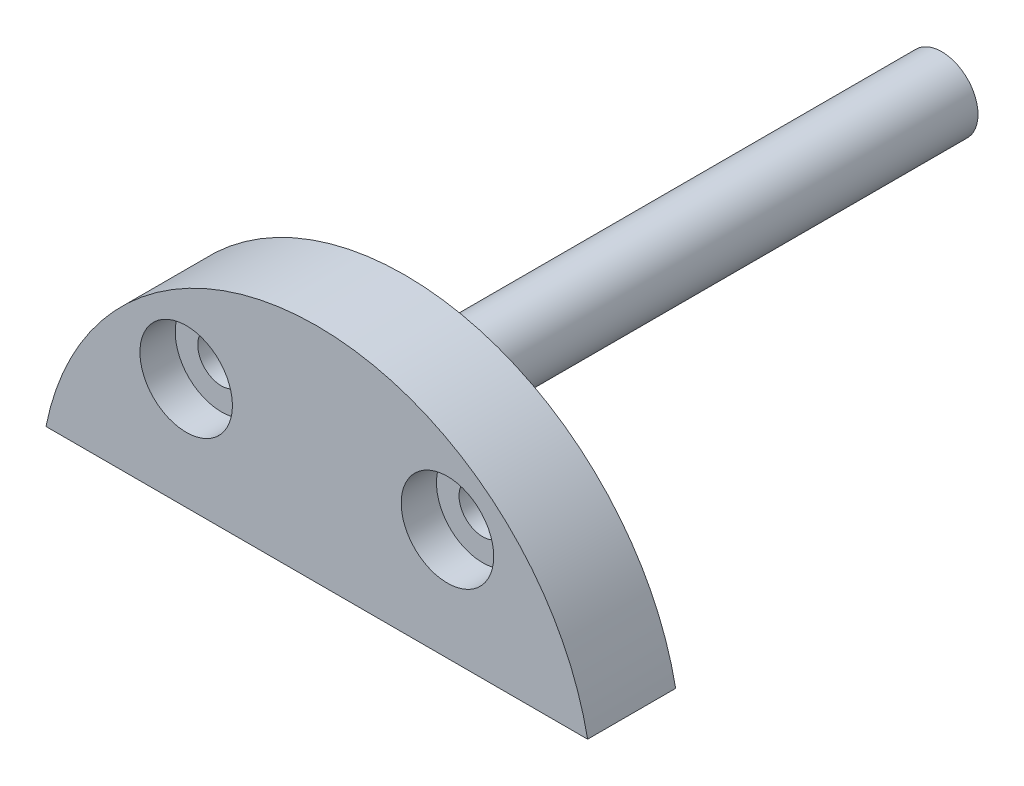
ISO-10303-21;
HEADER;
FILE_DESCRIPTION(('STEP AP214'),'2;1');
FILE_NAME('part.step','',(''),(''),'','','');
FILE_SCHEMA(('AUTOMOTIVE_DESIGN { 1 0 10303 214 1 1 1 1 }'));
ENDSEC;
DATA;
#1=APPLICATION_CONTEXT('core data for automotive mechanical design processes');
#2=APPLICATION_PROTOCOL_DEFINITION('international standard','automotive_design',2000,#1);
#3=PRODUCT_CONTEXT('',#1,'mechanical');
#4=PRODUCT('Part','Part','',(#3));
#5=PRODUCT_RELATED_PRODUCT_CATEGORY('part','',(#4));
#6=PRODUCT_DEFINITION_FORMATION('','',#4);
#7=PRODUCT_DEFINITION_CONTEXT('part definition',#1,'design');
#8=PRODUCT_DEFINITION('design','',#6,#7);
#9=PRODUCT_DEFINITION_SHAPE('','',#8);
#10=(LENGTH_UNIT() NAMED_UNIT(*) SI_UNIT(.MILLI.,.METRE.));
#11=(NAMED_UNIT(*) PLANE_ANGLE_UNIT() SI_UNIT($,.RADIAN.));
#12=(NAMED_UNIT(*) SI_UNIT($,.STERADIAN.) SOLID_ANGLE_UNIT());
#13=UNCERTAINTY_MEASURE_WITH_UNIT(LENGTH_MEASURE(1.E-05),#10,'distance_accuracy_value','');
#14=(GEOMETRIC_REPRESENTATION_CONTEXT(3) GLOBAL_UNCERTAINTY_ASSIGNED_CONTEXT((#13)) GLOBAL_UNIT_ASSIGNED_CONTEXT((#10,
#11,#12)) REPRESENTATION_CONTEXT('',''));
#15=CARTESIAN_POINT('',(0.,0.,0.));
#16=DIRECTION('',(0.,0.,1.));
#17=DIRECTION('',(1.,0.,0.));
#18=AXIS2_PLACEMENT_3D('',#15,#16,#17);
#19=CARTESIAN_POINT('',(14.3340852567701,12.215,-68.571));
#20=DIRECTION('',(0.,0.,1.));
#21=DIRECTION('',(1.,0.,0.));
#22=AXIS2_PLACEMENT_3D('',#19,#20,#21);
#23=CYLINDRICAL_SURFACE('',#22,2.6);
#24=CARTESIAN_POINT('',(14.3340852567701,12.215,-9.66));
#25=DIRECTION('',(0.,0.,-1.));
#26=DIRECTION('',(-1.,0.,0.));
#27=AXIS2_PLACEMENT_3D('',#24,#25,#26);
#28=CIRCLE('',#27,2.6);
#29=CARTESIAN_POINT('',(11.7340852567701,12.215,-9.66));
#30=VERTEX_POINT('',#29);
#31=EDGE_CURVE('E101',#30,#30,#28,.F.);
#32=ORIENTED_EDGE('',*,*,#31,.F.);
#33=EDGE_LOOP('',(#32));
#34=FACE_BOUND('',#33,.T.);
#35=CARTESIAN_POINT('',(14.3340852567701,12.215,-3.87));
#36=DIRECTION('',(0.,0.,1.));
#37=DIRECTION('',(1.,0.,0.));
#38=AXIS2_PLACEMENT_3D('',#35,#36,#37);
#39=CIRCLE('',#38,2.6);
#40=CARTESIAN_POINT('',(16.9340852567701,12.215,-3.87));
#41=VERTEX_POINT('',#40);
#42=EDGE_CURVE('E45',#41,#41,#39,.F.);
#43=ORIENTED_EDGE('',*,*,#42,.F.);
#44=EDGE_LOOP('',(#43));
#45=FACE_BOUND('',#44,.T.);
#46=ADVANCED_FACE('F41',(#34,#45),#23,.F.);
#47=CARTESIAN_POINT('',(-14.3340852567701,12.215,-68.571));
#48=DIRECTION('',(0.,0.,1.));
#49=DIRECTION('',(1.,0.,0.));
#50=AXIS2_PLACEMENT_3D('',#47,#48,#49);
#51=CYLINDRICAL_SURFACE('',#50,2.6);
#52=CARTESIAN_POINT('',(-14.3340852567701,12.215,-9.66));
#53=DIRECTION('',(0.,0.,-1.));
#54=DIRECTION('',(-1.,0.,0.));
#55=AXIS2_PLACEMENT_3D('',#52,#53,#54);
#56=CIRCLE('',#55,2.6);
#57=CARTESIAN_POINT('',(-16.9340852567701,12.215,-9.66));
#58=VERTEX_POINT('',#57);
#59=EDGE_CURVE('E119',#58,#58,#56,.F.);
#60=ORIENTED_EDGE('',*,*,#59,.F.);
#61=EDGE_LOOP('',(#60));
#62=FACE_BOUND('',#61,.T.);
#63=CARTESIAN_POINT('',(-14.3340852567701,12.215,-3.87));
#64=DIRECTION('',(0.,0.,1.));
#65=DIRECTION('',(1.,0.,0.));
#66=AXIS2_PLACEMENT_3D('',#63,#64,#65);
#67=CIRCLE('',#66,2.6);
#68=CARTESIAN_POINT('',(-11.7340852567701,12.215,-3.87));
#69=VERTEX_POINT('',#68);
#70=EDGE_CURVE('E92',#69,#69,#67,.F.);
#71=ORIENTED_EDGE('',*,*,#70,.F.);
#72=EDGE_LOOP('',(#71));
#73=FACE_BOUND('',#72,.T.);
#74=ADVANCED_FACE('F154',(#62,#73),#51,.F.);
#75=CARTESIAN_POINT('',(0.,-5.85665830945559,-9.66));
#76=DIRECTION('',(0.,0.,1.));
#77=DIRECTION('',(1.,0.,0.));
#78=AXIS2_PLACEMENT_3D('',#75,#76,#77);
#79=CYLINDRICAL_SURFACE('',#78,30.2866583094556);
#80=CARTESIAN_POINT('',(0.,-5.85665830945559,0.));
#81=DIRECTION('',(0.,0.,1.));
#82=DIRECTION('',(-1.,0.,0.));
#83=AXIS2_PLACEMENT_3D('',#80,#81,#82);
#84=CIRCLE('',#83,30.2866583094556);
#85=CARTESIAN_POINT('',(29.715,0.,0.));
#86=VERTEX_POINT('',#85);
#87=CARTESIAN_POINT('',(-29.715,0.,0.));
#88=VERTEX_POINT('',#87);
#89=EDGE_CURVE('E78',#86,#88,#84,.T.);
#90=ORIENTED_EDGE('',*,*,#89,.F.);
#91=DIRECTION('',(0.,0.,1.));
#92=VECTOR('',#91,1.);
#93=CARTESIAN_POINT('',(29.715,0.,-9.66));
#94=LINE('',#93,#92);
#95=CARTESIAN_POINT('',(29.715,0.,-9.66));
#96=VERTEX_POINT('',#95);
#97=EDGE_CURVE('E52',#96,#86,#94,.T.);
#98=ORIENTED_EDGE('',*,*,#97,.F.);
#99=CARTESIAN_POINT('',(0.,-5.85665830945559,-9.66));
#100=DIRECTION('',(0.,0.,1.));
#101=DIRECTION('',(-1.,0.,0.));
#102=AXIS2_PLACEMENT_3D('',#99,#100,#101);
#103=CIRCLE('',#102,30.2866583094556);
#104=CARTESIAN_POINT('',(-29.715,0.,-9.66));
#105=VERTEX_POINT('',#104);
#106=EDGE_CURVE('E85',#96,#105,#103,.T.);
#107=ORIENTED_EDGE('',*,*,#106,.T.);
#108=DIRECTION('',(0.,0.,1.));
#109=VECTOR('',#108,1.);
#110=CARTESIAN_POINT('',(-29.715,0.,-9.66));
#111=LINE('',#110,#109);
#112=EDGE_CURVE('E66',#105,#88,#111,.T.);
#113=ORIENTED_EDGE('',*,*,#112,.T.);
#114=EDGE_LOOP('',(#90,#98,#107,#113));
#115=FACE_BOUND('',#114,.T.);
#116=ADVANCED_FACE('F43',(#115),#79,.T.);
#117=CARTESIAN_POINT('',(-29.715,0.,-9.66));
#118=DIRECTION('',(0.,-1.,0.));
#119=DIRECTION('',(0.,0.,-1.));
#120=AXIS2_PLACEMENT_3D('',#117,#118,#119);
#121=PLANE('',#120);
#122=DIRECTION('',(1.,0.,0.));
#123=VECTOR('',#122,1.);
#124=CARTESIAN_POINT('',(-29.715,0.,0.));
#125=LINE('',#124,#123);
#126=EDGE_CURVE('E73',#88,#86,#125,.T.);
#127=ORIENTED_EDGE('',*,*,#126,.F.);
#128=ORIENTED_EDGE('',*,*,#112,.F.);
#129=DIRECTION('',(1.,0.,0.));
#130=VECTOR('',#129,1.);
#131=CARTESIAN_POINT('',(-29.715,0.,-9.66));
#132=LINE('',#131,#130);
#133=EDGE_CURVE('E75',#105,#96,#132,.T.);
#134=ORIENTED_EDGE('',*,*,#133,.T.);
#135=ORIENTED_EDGE('',*,*,#97,.T.);
#136=EDGE_LOOP('',(#127,#128,#134,#135));
#137=FACE_BOUND('',#136,.T.);
#138=ADVANCED_FACE('F71',(#137),#121,.T.);
#139=CARTESIAN_POINT('',(0.,-5.85665830945559,-9.66));
#140=DIRECTION('',(0.,0.,-1.));
#141=DIRECTION('',(-1.,0.,0.));
#142=AXIS2_PLACEMENT_3D('',#139,#140,#141);
#143=PLANE('',#142);
#144=ORIENTED_EDGE('',*,*,#59,.T.);
#145=EDGE_LOOP('',(#144));
#146=FACE_BOUND('',#145,.T.);
#147=ORIENTED_EDGE('',*,*,#31,.T.);
#148=EDGE_LOOP('',(#147));
#149=FACE_BOUND('',#148,.T.);
#150=CARTESIAN_POINT('',(0.,12.215,-9.66));
#151=DIRECTION('',(0.,0.,-1.));
#152=DIRECTION('',(-1.,0.,0.));
#153=AXIS2_PLACEMENT_3D('',#150,#151,#152);
#154=CIRCLE('',#153,3.98);
#155=CARTESIAN_POINT('',(3.98,12.215,-9.65999999999999));
#156=VERTEX_POINT('',#155);
#157=EDGE_CURVE('E11',#156,#156,#154,.T.);
#158=ORIENTED_EDGE('',*,*,#157,.F.);
#159=EDGE_LOOP('',(#158));
#160=FACE_BOUND('',#159,.T.);
#161=ORIENTED_EDGE('',*,*,#106,.F.);
#162=ORIENTED_EDGE('',*,*,#133,.F.);
#163=EDGE_LOOP('',(#161,#162));
#164=FACE_BOUND('',#163,.T.);
#165=ADVANCED_FACE('F139',(#146,#149,#160,#164),#143,.T.);
#166=CARTESIAN_POINT('',(0.,-5.85665830945559,0.));
#167=DIRECTION('',(0.,0.,-1.));
#168=DIRECTION('',(-1.,0.,0.));
#169=AXIS2_PLACEMENT_3D('',#166,#167,#168);
#170=PLANE('',#169);
#171=CARTESIAN_POINT('',(14.3340852567701,12.215,0.));
#172=DIRECTION('',(0.,0.,1.));
#173=DIRECTION('',(1.,0.,0.));
#174=AXIS2_PLACEMENT_3D('',#171,#172,#173);
#175=CIRCLE('',#174,5.075);
#176=CARTESIAN_POINT('',(19.4090852567701,12.215,0.));
#177=VERTEX_POINT('',#176);
#178=EDGE_CURVE('E103',#177,#177,#175,.T.);
#179=ORIENTED_EDGE('',*,*,#178,.F.);
#180=EDGE_LOOP('',(#179));
#181=FACE_BOUND('',#180,.T.);
#182=CARTESIAN_POINT('',(-14.3340852567701,12.215,0.));
#183=DIRECTION('',(0.,0.,1.));
#184=DIRECTION('',(1.,0.,0.));
#185=AXIS2_PLACEMENT_3D('',#182,#183,#184);
#186=CIRCLE('',#185,5.075);
#187=CARTESIAN_POINT('',(-9.25908525677012,12.215,0.));
#188=VERTEX_POINT('',#187);
#189=EDGE_CURVE('E115',#188,#188,#186,.T.);
#190=ORIENTED_EDGE('',*,*,#189,.F.);
#191=EDGE_LOOP('',(#190));
#192=FACE_BOUND('',#191,.T.);
#193=ORIENTED_EDGE('',*,*,#89,.T.);
#194=ORIENTED_EDGE('',*,*,#126,.T.);
#195=EDGE_LOOP('',(#193,#194));
#196=FACE_BOUND('',#195,.T.);
#197=ADVANCED_FACE('F83',(#181,#192,#196),#170,.F.);
#198=CARTESIAN_POINT('',(0.,12.215,-68.57));
#199=DIRECTION('',(0.,0.,1.));
#200=DIRECTION('',(1.,0.,0.));
#201=AXIS2_PLACEMENT_3D('',#198,#199,#200);
#202=CYLINDRICAL_SURFACE('',#201,3.98);
#203=CARTESIAN_POINT('',(0.,12.215,-68.57));
#204=DIRECTION('',(0.,0.,-1.));
#205=DIRECTION('',(-1.,0.,0.));
#206=AXIS2_PLACEMENT_3D('',#203,#204,#205);
#207=CIRCLE('',#206,3.98);
#208=CARTESIAN_POINT('',(3.98,12.215,-68.57));
#209=VERTEX_POINT('',#208);
#210=EDGE_CURVE('E81',#209,#209,#207,.T.);
#211=CARTESIAN_POINT('',(3.98,12.215,-68.57));
#212=CARTESIAN_POINT('',(3.98,12.215,-67.9563541666666));
#213=CARTESIAN_POINT('',(3.98,12.215,-67.3427083333333));
#214=CARTESIAN_POINT('',(3.98,12.215,-66.1154166666667));
#215=CARTESIAN_POINT('',(3.98,12.215,-65.5017708333333));
#216=CARTESIAN_POINT('',(3.98,12.215,-64.2744791666667));
#217=CARTESIAN_POINT('',(3.98,12.215,-63.6608333333333));
#218=CARTESIAN_POINT('',(3.98,12.215,-62.4335416666667));
#219=CARTESIAN_POINT('',(3.98,12.215,-61.8198958333333));
#220=CARTESIAN_POINT('',(3.98,12.215,-60.5926041666667));
#221=CARTESIAN_POINT('',(3.98,12.215,-59.9789583333333));
#222=CARTESIAN_POINT('',(3.98,12.215,-58.7516666666667));
#223=CARTESIAN_POINT('',(3.98,12.215,-58.1380208333333));
#224=CARTESIAN_POINT('',(3.98,12.215,-56.9107291666667));
#225=CARTESIAN_POINT('',(3.98,12.215,-56.2970833333333));
#226=CARTESIAN_POINT('',(3.98,12.215,-55.0697916666667));
#227=CARTESIAN_POINT('',(3.98,12.215,-54.4561458333333));
#228=CARTESIAN_POINT('',(3.98,12.215,-53.2288541666667));
#229=CARTESIAN_POINT('',(3.98,12.215,-52.6152083333333));
#230=CARTESIAN_POINT('',(3.98,12.215,-51.3879166666666));
#231=CARTESIAN_POINT('',(3.98,12.215,-50.7742708333333));
#232=CARTESIAN_POINT('',(3.98,12.215,-49.5469791666667));
#233=CARTESIAN_POINT('',(3.98,12.215,-48.9333333333333));
#234=CARTESIAN_POINT('',(3.98,12.215,-47.7060416666666));
#235=CARTESIAN_POINT('',(3.98,12.215,-47.0923958333333));
#236=CARTESIAN_POINT('',(3.98,12.215,-45.8651041666666));
#237=CARTESIAN_POINT('',(3.98,12.215,-45.2514583333333));
#238=CARTESIAN_POINT('',(3.98,12.215,-44.0241666666667));
#239=CARTESIAN_POINT('',(3.98,12.215,-43.4105208333333));
#240=CARTESIAN_POINT('',(3.98,12.215,-42.1832291666667));
#241=CARTESIAN_POINT('',(3.98,12.215,-41.5695833333333));
#242=CARTESIAN_POINT('',(3.98,12.215,-40.3422916666667));
#243=CARTESIAN_POINT('',(3.98,12.215,-39.7286458333333));
#244=CARTESIAN_POINT('',(3.98,12.215,-38.5013541666667));
#245=CARTESIAN_POINT('',(3.98,12.215,-37.8877083333333));
#246=CARTESIAN_POINT('',(3.98,12.215,-36.6604166666667));
#247=CARTESIAN_POINT('',(3.98,12.215,-36.0467708333333));
#248=CARTESIAN_POINT('',(3.98,12.215,-34.8194791666667));
#249=CARTESIAN_POINT('',(3.98,12.215,-34.2058333333333));
#250=CARTESIAN_POINT('',(3.98,12.215,-32.9785416666667));
#251=CARTESIAN_POINT('',(3.98,12.215,-32.3648958333333));
#252=CARTESIAN_POINT('',(3.98,12.215,-31.1376041666667));
#253=CARTESIAN_POINT('',(3.98,12.215,-30.5239583333333));
#254=CARTESIAN_POINT('',(3.98,12.215,-29.2966666666667));
#255=CARTESIAN_POINT('',(3.98,12.215,-28.6830208333333));
#256=CARTESIAN_POINT('',(3.98,12.215,-27.4557291666667));
#257=CARTESIAN_POINT('',(3.98,12.215,-26.8420833333333));
#258=CARTESIAN_POINT('',(3.98,12.215,-25.6147916666667));
#259=CARTESIAN_POINT('',(3.98,12.215,-25.0011458333333));
#260=CARTESIAN_POINT('',(3.98,12.215,-23.7738541666667));
#261=CARTESIAN_POINT('',(3.98,12.215,-23.1602083333333));
#262=CARTESIAN_POINT('',(3.98,12.215,-21.9329166666667));
#263=CARTESIAN_POINT('',(3.98,12.215,-21.3192708333333));
#264=CARTESIAN_POINT('',(3.98,12.215,-20.0919791666667));
#265=CARTESIAN_POINT('',(3.98,12.215,-19.4783333333333));
#266=CARTESIAN_POINT('',(3.98,12.215,-18.2510416666667));
#267=CARTESIAN_POINT('',(3.98,12.215,-17.6373958333333));
#268=CARTESIAN_POINT('',(3.98,12.215,-16.4101041666667));
#269=CARTESIAN_POINT('',(3.98,12.215,-15.7964583333333));
#270=CARTESIAN_POINT('',(3.98,12.215,-14.5691666666667));
#271=CARTESIAN_POINT('',(3.98,12.215,-13.9555208333333));
#272=CARTESIAN_POINT('',(3.98,12.215,-12.7282291666667));
#273=CARTESIAN_POINT('',(3.98,12.215,-12.1145833333333));
#274=CARTESIAN_POINT('',(3.98,12.215,-10.8872916666667));
#275=CARTESIAN_POINT('',(3.98,12.215,-10.2736458333333));
#276=CARTESIAN_POINT('',(3.98,12.215,-9.65999999999999));
#277=B_SPLINE_CURVE_WITH_KNOTS('',3,(#211,#212,#213,#214,#215,#216,#217,#218,#219,#220,#221,
#222,#223,#224,#225,#226,#227,#228,#229,#230,#231,#232,#233,#234,#235,#236,#237,#238,#239,#240,
#241,#242,#243,#244,#245,#246,#247,#248,#249,#250,#251,#252,#253,#254,#255,#256,#257,#258,#259,
#260,#261,#262,#263,#264,#265,#266,#267,#268,#269,#270,#271,#272,#273,#274,#275,#276),
.UNSPECIFIED.,.F.,.F.,(4,2,2,2,2,2,2,2,2,2,2,2,2,2,2,2,2,2,2,2,2,2,2,2,2,2,2,2,2,2,2,2,4),(0.,
1.84093749999999,3.68187499999999,5.52281249999999,7.36374999999999,9.20468749999999,11.045625,
12.8865625,14.7275,16.5684375,18.409375,20.2503125,22.09125,23.9321875,25.773125,27.6140625,
29.455,31.2959375,33.136875,34.9778125,36.81875,38.6596875,40.500625,42.3415625,44.1825,
46.0234375,47.864375,49.7053125,51.54625,53.3871875,55.228125,57.0690625,58.91),.UNSPECIFIED.);
#278=EDGE_CURVE('BSEAM133',#209,#156,#277,.T.);
#279=ORIENTED_EDGE('',*,*,#210,.F.);
#280=ORIENTED_EDGE('',*,*,#157,.T.);
#281=ORIENTED_EDGE('',*,*,#278,.T.);
#282=ORIENTED_EDGE('',*,*,#278,.F.);
#283=EDGE_LOOP('',(#279,#281,#280,#282));
#284=FACE_BOUND('',#283,.T.);
#285=ADVANCED_FACE('F133',(#284),#202,.T.);
#286=CARTESIAN_POINT('',(0.,12.215,-68.57));
#287=DIRECTION('',(0.,0.,-1.));
#288=DIRECTION('',(-1.,0.,0.));
#289=AXIS2_PLACEMENT_3D('',#286,#287,#288);
#290=PLANE('',#289);
#291=ORIENTED_EDGE('',*,*,#210,.T.);
#292=EDGE_LOOP('',(#291));
#293=FACE_BOUND('',#292,.T.);
#294=ADVANCED_FACE('F131',(#293),#290,.T.);
#295=CARTESIAN_POINT('',(-14.3340852567701,12.215,-3.87));
#296=DIRECTION('',(0.,0.,1.));
#297=DIRECTION('',(1.,0.,0.));
#298=AXIS2_PLACEMENT_3D('',#295,#296,#297);
#299=PLANE('',#298);
#300=CARTESIAN_POINT('',(-14.3340852567701,12.215,-3.87));
#301=DIRECTION('',(0.,0.,1.));
#302=DIRECTION('',(1.,0.,0.));
#303=AXIS2_PLACEMENT_3D('',#300,#301,#302);
#304=CIRCLE('',#303,5.075);
#305=CARTESIAN_POINT('',(-9.25908525677012,12.215,-3.87));
#306=VERTEX_POINT('',#305);
#307=EDGE_CURVE('E109',#306,#306,#304,.T.);
#308=ORIENTED_EDGE('',*,*,#307,.T.);
#309=EDGE_LOOP('',(#308));
#310=FACE_BOUND('',#309,.T.);
#311=ORIENTED_EDGE('',*,*,#70,.T.);
#312=EDGE_LOOP('',(#311));
#313=FACE_BOUND('',#312,.T.);
#314=ADVANCED_FACE('F167',(#310,#313),#299,.T.);
#315=CARTESIAN_POINT('',(-14.3340852567701,12.215,-3.87));
#316=DIRECTION('',(0.,0.,1.));
#317=DIRECTION('',(1.,0.,0.));
#318=AXIS2_PLACEMENT_3D('',#315,#316,#317);
#319=CYLINDRICAL_SURFACE('',#318,5.075);
#320=CARTESIAN_POINT('',(-9.25908525677012,12.215,-3.87));
#321=CARTESIAN_POINT('',(-9.25908525677012,12.215,-3.8296875));
#322=CARTESIAN_POINT('',(-9.25908525677012,12.215,-3.789375));
#323=CARTESIAN_POINT('',(-9.25908525677012,12.215,-3.70875));
#324=CARTESIAN_POINT('',(-9.25908525677012,12.215,-3.6684375));
#325=CARTESIAN_POINT('',(-9.25908525677012,12.215,-3.5878125));
#326=CARTESIAN_POINT('',(-9.25908525677012,12.215,-3.5475));
#327=CARTESIAN_POINT('',(-9.25908525677012,12.215,-3.466875));
#328=CARTESIAN_POINT('',(-9.25908525677012,12.215,-3.4265625));
#329=CARTESIAN_POINT('',(-9.25908525677012,12.215,-3.3459375));
#330=CARTESIAN_POINT('',(-9.25908525677012,12.215,-3.305625));
#331=CARTESIAN_POINT('',(-9.25908525677012,12.215,-3.225));
#332=CARTESIAN_POINT('',(-9.25908525677012,12.215,-3.1846875));
#333=CARTESIAN_POINT('',(-9.25908525677012,12.215,-3.1040625));
#334=CARTESIAN_POINT('',(-9.25908525677012,12.215,-3.06375));
#335=CARTESIAN_POINT('',(-9.25908525677012,12.215,-2.983125));
#336=CARTESIAN_POINT('',(-9.25908525677012,12.215,-2.9428125));
#337=CARTESIAN_POINT('',(-9.25908525677012,12.215,-2.8621875));
#338=CARTESIAN_POINT('',(-9.25908525677012,12.215,-2.821875));
#339=CARTESIAN_POINT('',(-9.25908525677012,12.215,-2.74125));
#340=CARTESIAN_POINT('',(-9.25908525677012,12.215,-2.7009375));
#341=CARTESIAN_POINT('',(-9.25908525677012,12.215,-2.6203125));
#342=CARTESIAN_POINT('',(-9.25908525677012,12.215,-2.58));
#343=CARTESIAN_POINT('',(-9.25908525677012,12.215,-2.499375));
#344=CARTESIAN_POINT('',(-9.25908525677012,12.215,-2.4590625));
#345=CARTESIAN_POINT('',(-9.25908525677012,12.215,-2.3784375));
#346=CARTESIAN_POINT('',(-9.25908525677012,12.215,-2.338125));
#347=CARTESIAN_POINT('',(-9.25908525677012,12.215,-2.2575));
#348=CARTESIAN_POINT('',(-9.25908525677012,12.215,-2.2171875));
#349=CARTESIAN_POINT('',(-9.25908525677012,12.215,-2.1365625));
#350=CARTESIAN_POINT('',(-9.25908525677012,12.215,-2.09625));
#351=CARTESIAN_POINT('',(-9.25908525677012,12.215,-2.015625));
#352=CARTESIAN_POINT('',(-9.25908525677012,12.215,-1.9753125));
#353=CARTESIAN_POINT('',(-9.25908525677012,12.215,-1.8946875));
#354=CARTESIAN_POINT('',(-9.25908525677012,12.215,-1.854375));
#355=CARTESIAN_POINT('',(-9.25908525677012,12.215,-1.77375));
#356=CARTESIAN_POINT('',(-9.25908525677012,12.215,-1.7334375));
#357=CARTESIAN_POINT('',(-9.25908525677012,12.215,-1.6528125));
#358=CARTESIAN_POINT('',(-9.25908525677012,12.215,-1.6125));
#359=CARTESIAN_POINT('',(-9.25908525677012,12.215,-1.531875));
#360=CARTESIAN_POINT('',(-9.25908525677012,12.215,-1.4915625));
#361=CARTESIAN_POINT('',(-9.25908525677012,12.215,-1.4109375));
#362=CARTESIAN_POINT('',(-9.25908525677012,12.215,-1.370625));
#363=CARTESIAN_POINT('',(-9.25908525677012,12.215,-1.29));
#364=CARTESIAN_POINT('',(-9.25908525677012,12.215,-1.2496875));
#365=CARTESIAN_POINT('',(-9.25908525677012,12.215,-1.1690625));
#366=CARTESIAN_POINT('',(-9.25908525677012,12.215,-1.12875));
#367=CARTESIAN_POINT('',(-9.25908525677012,12.215,-1.048125));
#368=CARTESIAN_POINT('',(-9.25908525677012,12.215,-1.0078125));
#369=CARTESIAN_POINT('',(-9.25908525677012,12.215,-0.9271875));
#370=CARTESIAN_POINT('',(-9.25908525677012,12.215,-0.886875000000001));
#371=CARTESIAN_POINT('',(-9.25908525677012,12.215,-0.806250000000001));
#372=CARTESIAN_POINT('',(-9.25908525677012,12.215,-0.765937500000001));
#373=CARTESIAN_POINT('',(-9.25908525677012,12.215,-0.685312500000001));
#374=CARTESIAN_POINT('',(-9.25908525677012,12.215,-0.645000000000001));
#375=CARTESIAN_POINT('',(-9.25908525677012,12.215,-0.564375000000001));
#376=CARTESIAN_POINT('',(-9.25908525677012,12.215,-0.524062500000001));
#377=CARTESIAN_POINT('',(-9.25908525677012,12.215,-0.443437500000001));
#378=CARTESIAN_POINT('',(-9.25908525677012,12.215,-0.403125));
#379=CARTESIAN_POINT('',(-9.25908525677012,12.215,-0.3225));
#380=CARTESIAN_POINT('',(-9.25908525677012,12.215,-0.2821875));
#381=CARTESIAN_POINT('',(-9.25908525677012,12.215,-0.2015625));
#382=CARTESIAN_POINT('',(-9.25908525677012,12.215,-0.16125));
#383=CARTESIAN_POINT('',(-9.25908525677012,12.215,-0.0806250000000004));
#384=CARTESIAN_POINT('',(-9.25908525677012,12.215,-0.0403125000000004));
#385=CARTESIAN_POINT('',(-9.25908525677012,12.215,0.));
#386=B_SPLINE_CURVE_WITH_KNOTS('',3,(#320,#321,#322,#323,#324,#325,#326,#327,#328,#329,#330,
#331,#332,#333,#334,#335,#336,#337,#338,#339,#340,#341,#342,#343,#344,#345,#346,#347,#348,#349,
#350,#351,#352,#353,#354,#355,#356,#357,#358,#359,#360,#361,#362,#363,#364,#365,#366,#367,#368,
#369,#370,#371,#372,#373,#374,#375,#376,#377,#378,#379,#380,#381,#382,#383,#384,#385),
.UNSPECIFIED.,.F.,.F.,(4,2,2,2,2,2,2,2,2,2,2,2,2,2,2,2,2,2,2,2,2,2,2,2,2,2,2,2,2,2,2,2,4),(0.,
0.1209375,0.241875,0.3628125,0.48375,0.6046875,0.725625,0.8465625,0.9675,1.0884375,1.209375,
1.3303125,1.45125,1.5721875,1.693125,1.8140625,1.935,2.0559375,2.176875,2.2978125,2.41875,
2.5396875,2.660625,2.7815625,2.9025,3.0234375,3.144375,3.2653125,3.38625,3.5071875,3.628125,
3.7490625,3.87),.UNSPECIFIED.);
#387=EDGE_CURVE('BSEAM170',#306,#188,#386,.T.);
#388=ORIENTED_EDGE('',*,*,#307,.F.);
#389=ORIENTED_EDGE('',*,*,#189,.T.);
#390=ORIENTED_EDGE('',*,*,#387,.T.);
#391=ORIENTED_EDGE('',*,*,#387,.F.);
#392=EDGE_LOOP('',(#388,#390,#389,#391));
#393=FACE_BOUND('',#392,.T.);
#394=ADVANCED_FACE('F170',(#393),#319,.F.);
#395=CARTESIAN_POINT('',(14.3340852567701,12.215,-3.87));
#396=DIRECTION('',(0.,0.,1.));
#397=DIRECTION('',(1.,0.,0.));
#398=AXIS2_PLACEMENT_3D('',#395,#396,#397);
#399=PLANE('',#398);
#400=CARTESIAN_POINT('',(14.3340852567701,12.215,-3.87));
#401=DIRECTION('',(0.,0.,1.));
#402=DIRECTION('',(1.,0.,0.));
#403=AXIS2_PLACEMENT_3D('',#400,#401,#402);
#404=CIRCLE('',#403,5.075);
#405=CARTESIAN_POINT('',(19.4090852567701,12.215,-3.87));
#406=VERTEX_POINT('',#405);
#407=EDGE_CURVE('E95',#406,#406,#404,.T.);
#408=ORIENTED_EDGE('',*,*,#407,.T.);
#409=EDGE_LOOP('',(#408));
#410=FACE_BOUND('',#409,.T.);
#411=ORIENTED_EDGE('',*,*,#42,.T.);
#412=EDGE_LOOP('',(#411));
#413=FACE_BOUND('',#412,.T.);
#414=ADVANCED_FACE('F176',(#410,#413),#399,.T.);
#415=CARTESIAN_POINT('',(14.3340852567701,12.215,-3.87));
#416=DIRECTION('',(0.,0.,1.));
#417=DIRECTION('',(1.,0.,0.));
#418=AXIS2_PLACEMENT_3D('',#415,#416,#417);
#419=CYLINDRICAL_SURFACE('',#418,5.075);
#420=CARTESIAN_POINT('',(19.4090852567701,12.215,-3.87));
#421=CARTESIAN_POINT('',(19.4090852567701,12.215,-3.8296875));
#422=CARTESIAN_POINT('',(19.4090852567701,12.215,-3.789375));
#423=CARTESIAN_POINT('',(19.4090852567701,12.215,-3.70875));
#424=CARTESIAN_POINT('',(19.4090852567701,12.215,-3.6684375));
#425=CARTESIAN_POINT('',(19.4090852567701,12.215,-3.5878125));
#426=CARTESIAN_POINT('',(19.4090852567701,12.215,-3.5475));
#427=CARTESIAN_POINT('',(19.4090852567701,12.215,-3.466875));
#428=CARTESIAN_POINT('',(19.4090852567701,12.215,-3.4265625));
#429=CARTESIAN_POINT('',(19.4090852567701,12.215,-3.3459375));
#430=CARTESIAN_POINT('',(19.4090852567701,12.215,-3.305625));
#431=CARTESIAN_POINT('',(19.4090852567701,12.215,-3.225));
#432=CARTESIAN_POINT('',(19.4090852567701,12.215,-3.1846875));
#433=CARTESIAN_POINT('',(19.4090852567701,12.215,-3.1040625));
#434=CARTESIAN_POINT('',(19.4090852567701,12.215,-3.06375));
#435=CARTESIAN_POINT('',(19.4090852567701,12.215,-2.983125));
#436=CARTESIAN_POINT('',(19.4090852567701,12.215,-2.9428125));
#437=CARTESIAN_POINT('',(19.4090852567701,12.215,-2.8621875));
#438=CARTESIAN_POINT('',(19.4090852567701,12.215,-2.821875));
#439=CARTESIAN_POINT('',(19.4090852567701,12.215,-2.74125));
#440=CARTESIAN_POINT('',(19.4090852567701,12.215,-2.7009375));
#441=CARTESIAN_POINT('',(19.4090852567701,12.215,-2.6203125));
#442=CARTESIAN_POINT('',(19.4090852567701,12.215,-2.58));
#443=CARTESIAN_POINT('',(19.4090852567701,12.215,-2.499375));
#444=CARTESIAN_POINT('',(19.4090852567701,12.215,-2.4590625));
#445=CARTESIAN_POINT('',(19.4090852567701,12.215,-2.3784375));
#446=CARTESIAN_POINT('',(19.4090852567701,12.215,-2.338125));
#447=CARTESIAN_POINT('',(19.4090852567701,12.215,-2.2575));
#448=CARTESIAN_POINT('',(19.4090852567701,12.215,-2.2171875));
#449=CARTESIAN_POINT('',(19.4090852567701,12.215,-2.1365625));
#450=CARTESIAN_POINT('',(19.4090852567701,12.215,-2.09625));
#451=CARTESIAN_POINT('',(19.4090852567701,12.215,-2.015625));
#452=CARTESIAN_POINT('',(19.4090852567701,12.215,-1.9753125));
#453=CARTESIAN_POINT('',(19.4090852567701,12.215,-1.8946875));
#454=CARTESIAN_POINT('',(19.4090852567701,12.215,-1.854375));
#455=CARTESIAN_POINT('',(19.4090852567701,12.215,-1.77375));
#456=CARTESIAN_POINT('',(19.4090852567701,12.215,-1.7334375));
#457=CARTESIAN_POINT('',(19.4090852567701,12.215,-1.6528125));
#458=CARTESIAN_POINT('',(19.4090852567701,12.215,-1.6125));
#459=CARTESIAN_POINT('',(19.4090852567701,12.215,-1.531875));
#460=CARTESIAN_POINT('',(19.4090852567701,12.215,-1.4915625));
#461=CARTESIAN_POINT('',(19.4090852567701,12.215,-1.4109375));
#462=CARTESIAN_POINT('',(19.4090852567701,12.215,-1.370625));
#463=CARTESIAN_POINT('',(19.4090852567701,12.215,-1.29));
#464=CARTESIAN_POINT('',(19.4090852567701,12.215,-1.2496875));
#465=CARTESIAN_POINT('',(19.4090852567701,12.215,-1.1690625));
#466=CARTESIAN_POINT('',(19.4090852567701,12.215,-1.12875));
#467=CARTESIAN_POINT('',(19.4090852567701,12.215,-1.048125));
#468=CARTESIAN_POINT('',(19.4090852567701,12.215,-1.0078125));
#469=CARTESIAN_POINT('',(19.4090852567701,12.215,-0.9271875));
#470=CARTESIAN_POINT('',(19.4090852567701,12.215,-0.886875000000001));
#471=CARTESIAN_POINT('',(19.4090852567701,12.215,-0.806250000000001));
#472=CARTESIAN_POINT('',(19.4090852567701,12.215,-0.765937500000001));
#473=CARTESIAN_POINT('',(19.4090852567701,12.215,-0.685312500000001));
#474=CARTESIAN_POINT('',(19.4090852567701,12.215,-0.645000000000001));
#475=CARTESIAN_POINT('',(19.4090852567701,12.215,-0.564375000000001));
#476=CARTESIAN_POINT('',(19.4090852567701,12.215,-0.524062500000001));
#477=CARTESIAN_POINT('',(19.4090852567701,12.215,-0.443437500000001));
#478=CARTESIAN_POINT('',(19.4090852567701,12.215,-0.403125));
#479=CARTESIAN_POINT('',(19.4090852567701,12.215,-0.3225));
#480=CARTESIAN_POINT('',(19.4090852567701,12.215,-0.2821875));
#481=CARTESIAN_POINT('',(19.4090852567701,12.215,-0.2015625));
#482=CARTESIAN_POINT('',(19.4090852567701,12.215,-0.16125));
#483=CARTESIAN_POINT('',(19.4090852567701,12.215,-0.0806250000000004));
#484=CARTESIAN_POINT('',(19.4090852567701,12.215,-0.0403125000000004));
#485=CARTESIAN_POINT('',(19.4090852567701,12.215,0.));
#486=B_SPLINE_CURVE_WITH_KNOTS('',3,(#420,#421,#422,#423,#424,#425,#426,#427,#428,#429,#430,
#431,#432,#433,#434,#435,#436,#437,#438,#439,#440,#441,#442,#443,#444,#445,#446,#447,#448,#449,
#450,#451,#452,#453,#454,#455,#456,#457,#458,#459,#460,#461,#462,#463,#464,#465,#466,#467,#468,
#469,#470,#471,#472,#473,#474,#475,#476,#477,#478,#479,#480,#481,#482,#483,#484,#485),
.UNSPECIFIED.,.F.,.F.,(4,2,2,2,2,2,2,2,2,2,2,2,2,2,2,2,2,2,2,2,2,2,2,2,2,2,2,2,2,2,2,2,4),(0.,
0.1209375,0.241875,0.3628125,0.48375,0.6046875,0.725625,0.8465625,0.9675,1.0884375,1.209375,
1.3303125,1.45125,1.5721875,1.693125,1.8140625,1.935,2.0559375,2.176875,2.2978125,2.41875,
2.5396875,2.660625,2.7815625,2.9025,3.0234375,3.144375,3.2653125,3.38625,3.5071875,3.628125,
3.7490625,3.87),.UNSPECIFIED.);
#487=EDGE_CURVE('BSEAM179',#406,#177,#486,.T.);
#488=ORIENTED_EDGE('',*,*,#407,.F.);
#489=ORIENTED_EDGE('',*,*,#178,.T.);
#490=ORIENTED_EDGE('',*,*,#487,.T.);
#491=ORIENTED_EDGE('',*,*,#487,.F.);
#492=EDGE_LOOP('',(#488,#490,#489,#491));
#493=FACE_BOUND('',#492,.T.);
#494=ADVANCED_FACE('F179',(#493),#419,.F.);
#495=CLOSED_SHELL('',(#46,#74,#116,#138,#165,#197,#285,#294,#314,#394,#414,#494));
#496=MANIFOLD_SOLID_BREP('B2',#495);
#497=ADVANCED_BREP_SHAPE_REPRESENTATION('',(#18,#496),#14);
#498=SHAPE_DEFINITION_REPRESENTATION(#9,#497);
ENDSEC;
END-ISO-10303-21;
